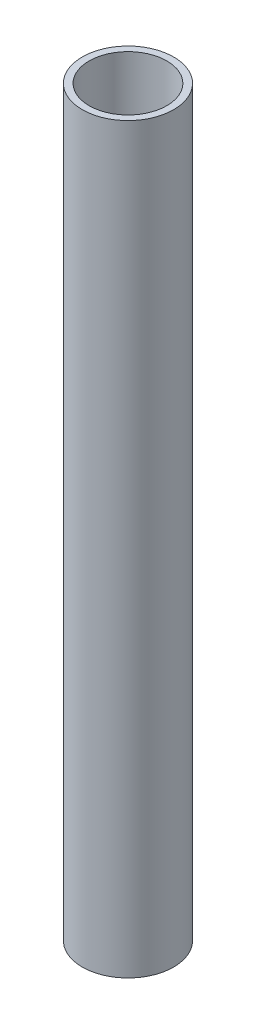
ISO-10303-21;
HEADER;
FILE_DESCRIPTION(('STEP AP214'),'2;1');
FILE_NAME('part.step','',(''),(''),'','','');
FILE_SCHEMA(('AUTOMOTIVE_DESIGN { 1 0 10303 214 1 1 1 1 }'));
ENDSEC;
DATA;
#1=APPLICATION_CONTEXT('core data for automotive mechanical design processes');
#2=APPLICATION_PROTOCOL_DEFINITION('international standard','automotive_design',2000,#1);
#3=PRODUCT_CONTEXT('',#1,'mechanical');
#4=PRODUCT('Part','Part','',(#3));
#5=PRODUCT_RELATED_PRODUCT_CATEGORY('part','',(#4));
#6=PRODUCT_DEFINITION_FORMATION('','',#4);
#7=PRODUCT_DEFINITION_CONTEXT('part definition',#1,'design');
#8=PRODUCT_DEFINITION('design','',#6,#7);
#9=PRODUCT_DEFINITION_SHAPE('','',#8);
#10=(LENGTH_UNIT() NAMED_UNIT(*) SI_UNIT(.MILLI.,.METRE.));
#11=(NAMED_UNIT(*) PLANE_ANGLE_UNIT() SI_UNIT($,.RADIAN.));
#12=(NAMED_UNIT(*) SI_UNIT($,.STERADIAN.) SOLID_ANGLE_UNIT());
#13=UNCERTAINTY_MEASURE_WITH_UNIT(LENGTH_MEASURE(1.E-05),#10,'distance_accuracy_value','');
#14=(GEOMETRIC_REPRESENTATION_CONTEXT(3) GLOBAL_UNCERTAINTY_ASSIGNED_CONTEXT((#13)) GLOBAL_UNIT_ASSIGNED_CONTEXT((#10,
#11,#12)) REPRESENTATION_CONTEXT('',''));
#15=CARTESIAN_POINT('',(0.,0.,0.));
#16=DIRECTION('',(0.,0.,1.));
#17=DIRECTION('',(1.,0.,0.));
#18=AXIS2_PLACEMENT_3D('',#15,#16,#17);
#19=CARTESIAN_POINT('',(0.,260.,0.));
#20=DIRECTION('',(0.,1.,0.));
#21=DIRECTION('',(0.,0.,1.));
#22=AXIS2_PLACEMENT_3D('',#19,#20,#21);
#23=PLANE('',#22);
#24=CARTESIAN_POINT('',(0.,260.,0.));
#25=DIRECTION('',(0.,1.,0.));
#26=DIRECTION('',(0.,0.,1.));
#27=AXIS2_PLACEMENT_3D('',#24,#25,#26);
#28=CIRCLE('',#27,16.);
#29=CARTESIAN_POINT('',(0.,260.,16.));
#30=VERTEX_POINT('',#29);
#31=EDGE_CURVE('E10',#30,#30,#28,.T.);
#32=ORIENTED_EDGE('',*,*,#31,.T.);
#33=EDGE_LOOP('',(#32));
#34=FACE_BOUND('',#33,.T.);
#35=CARTESIAN_POINT('',(0.,260.,0.));
#36=DIRECTION('',(0.,1.,0.));
#37=DIRECTION('',(0.,0.,1.));
#38=AXIS2_PLACEMENT_3D('',#35,#36,#37);
#39=CIRCLE('',#38,13.6);
#40=CARTESIAN_POINT('',(0.,260.,13.6));
#41=VERTEX_POINT('',#40);
#42=EDGE_CURVE('E48',#41,#41,#39,.T.);
#43=ORIENTED_EDGE('',*,*,#42,.F.);
#44=EDGE_LOOP('',(#43));
#45=FACE_BOUND('',#44,.T.);
#46=ADVANCED_FACE('F37',(#34,#45),#23,.T.);
#47=CARTESIAN_POINT('',(0.,0.,0.));
#48=DIRECTION('',(0.,1.,0.));
#49=DIRECTION('',(0.,0.,1.));
#50=AXIS2_PLACEMENT_3D('',#47,#48,#49);
#51=PLANE('',#50);
#52=CARTESIAN_POINT('',(0.,0.,0.));
#53=DIRECTION('',(0.,1.,0.));
#54=DIRECTION('',(0.,0.,1.));
#55=AXIS2_PLACEMENT_3D('',#52,#53,#54);
#56=CIRCLE('',#55,16.);
#57=CARTESIAN_POINT('',(0.,0.,16.));
#58=VERTEX_POINT('',#57);
#59=EDGE_CURVE('E41',#58,#58,#56,.T.);
#60=ORIENTED_EDGE('',*,*,#59,.F.);
#61=EDGE_LOOP('',(#60));
#62=FACE_BOUND('',#61,.T.);
#63=CARTESIAN_POINT('',(0.,0.,0.));
#64=DIRECTION('',(0.,1.,0.));
#65=DIRECTION('',(0.,0.,1.));
#66=AXIS2_PLACEMENT_3D('',#63,#64,#65);
#67=CIRCLE('',#66,13.6);
#68=CARTESIAN_POINT('',(0.,0.,13.6));
#69=VERTEX_POINT('',#68);
#70=EDGE_CURVE('E50',#69,#69,#67,.T.);
#71=ORIENTED_EDGE('',*,*,#70,.T.);
#72=EDGE_LOOP('',(#71));
#73=FACE_BOUND('',#72,.T.);
#74=ADVANCED_FACE('F60',(#62,#73),#51,.F.);
#75=CARTESIAN_POINT('',(0.,260.,0.));
#76=DIRECTION('',(0.,-1.,0.));
#77=DIRECTION('',(0.,0.,-1.));
#78=AXIS2_PLACEMENT_3D('',#75,#76,#77);
#79=CYLINDRICAL_SURFACE('',#78,16.);
#80=ORIENTED_EDGE('',*,*,#31,.F.);
#81=EDGE_LOOP('',(#80));
#82=FACE_BOUND('',#81,.T.);
#83=ORIENTED_EDGE('',*,*,#59,.T.);
#84=EDGE_LOOP('',(#83));
#85=FACE_BOUND('',#84,.T.);
#86=ADVANCED_FACE('F39',(#82,#85),#79,.T.);
#87=CARTESIAN_POINT('',(0.,260.,0.));
#88=DIRECTION('',(0.,-1.,0.));
#89=DIRECTION('',(0.,0.,-1.));
#90=AXIS2_PLACEMENT_3D('',#87,#88,#89);
#91=CYLINDRICAL_SURFACE('',#90,13.6);
#92=ORIENTED_EDGE('',*,*,#42,.T.);
#93=EDGE_LOOP('',(#92));
#94=FACE_BOUND('',#93,.T.);
#95=ORIENTED_EDGE('',*,*,#70,.F.);
#96=EDGE_LOOP('',(#95));
#97=FACE_BOUND('',#96,.T.);
#98=ADVANCED_FACE('F56',(#94,#97),#91,.F.);
#99=CLOSED_SHELL('',(#46,#74,#86,#98));
#100=MANIFOLD_SOLID_BREP('B2',#99);
#101=ADVANCED_BREP_SHAPE_REPRESENTATION('',(#18,#100),#14);
#102=SHAPE_DEFINITION_REPRESENTATION(#9,#101);
ENDSEC;
END-ISO-10303-21;
